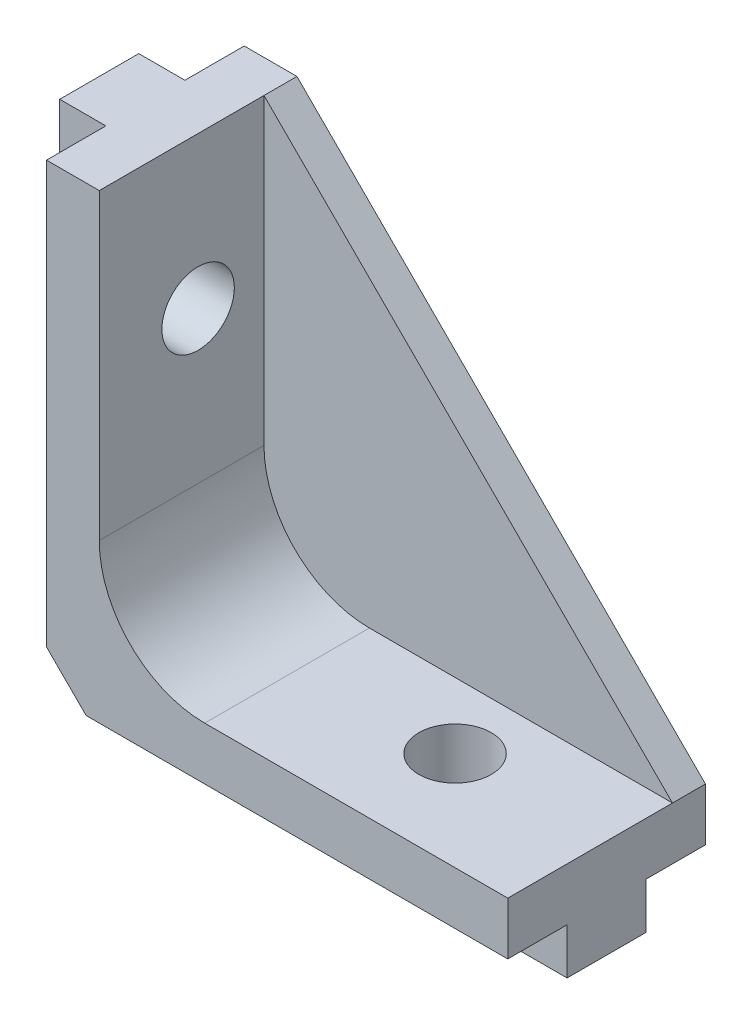
ISO-10303-21;
HEADER;
FILE_DESCRIPTION(('STEP AP214'),'2;1');
FILE_NAME('part.step','',(''),(''),'','','');
FILE_SCHEMA(('AUTOMOTIVE_DESIGN { 1 0 10303 214 1 1 1 1 }'));
ENDSEC;
DATA;
#1=APPLICATION_CONTEXT('core data for automotive mechanical design processes');
#2=APPLICATION_PROTOCOL_DEFINITION('international standard','automotive_design',2000,#1);
#3=PRODUCT_CONTEXT('',#1,'mechanical');
#4=PRODUCT('Part','Part','',(#3));
#5=PRODUCT_RELATED_PRODUCT_CATEGORY('part','',(#4));
#6=PRODUCT_DEFINITION_FORMATION('','',#4);
#7=PRODUCT_DEFINITION_CONTEXT('part definition',#1,'design');
#8=PRODUCT_DEFINITION('design','',#6,#7);
#9=PRODUCT_DEFINITION_SHAPE('','',#8);
#10=(LENGTH_UNIT() NAMED_UNIT(*) SI_UNIT(.MILLI.,.METRE.));
#11=(NAMED_UNIT(*) PLANE_ANGLE_UNIT() SI_UNIT($,.RADIAN.));
#12=(NAMED_UNIT(*) SI_UNIT($,.STERADIAN.) SOLID_ANGLE_UNIT());
#13=UNCERTAINTY_MEASURE_WITH_UNIT(LENGTH_MEASURE(1.E-05),#10,'distance_accuracy_value','');
#14=(GEOMETRIC_REPRESENTATION_CONTEXT(3) GLOBAL_UNCERTAINTY_ASSIGNED_CONTEXT((#13)) GLOBAL_UNIT_ASSIGNED_CONTEXT((#10,
#11,#12)) REPRESENTATION_CONTEXT('',''));
#15=CARTESIAN_POINT('',(0.,0.,0.));
#16=DIRECTION('',(0.,0.,1.));
#17=DIRECTION('',(1.,0.,0.));
#18=AXIS2_PLACEMENT_3D('',#15,#16,#17);
#19=CARTESIAN_POINT('',(0.,0.,2.5));
#20=DIRECTION('',(1.,0.,0.));
#21=DIRECTION('',(0.,0.,-1.));
#22=AXIS2_PLACEMENT_3D('',#19,#20,#21);
#23=PLANE('',#22);
#24=DIRECTION('',(0.,-1.,0.));
#25=VECTOR('',#24,1.);
#26=CARTESIAN_POINT('',(0.,0.,0.));
#27=LINE('',#26,#25);
#28=CARTESIAN_POINT('',(0.,35.,0.));
#29=VERTEX_POINT('',#28);
#30=CARTESIAN_POINT('',(0.,3.00000000000002,0.));
#31=VERTEX_POINT('',#30);
#32=EDGE_CURVE('E249',#29,#31,#27,.T.);
#33=ORIENTED_EDGE('',*,*,#32,.T.);
#34=DIRECTION('',(0.,0.,1.));
#35=VECTOR('',#34,1.);
#36=CARTESIAN_POINT('',(0.,3.00000000000002,2.5));
#37=LINE('',#36,#35);
#38=CARTESIAN_POINT('',(0.,3.00000000000002,15.));
#39=VERTEX_POINT('',#38);
#40=EDGE_CURVE('E47',#31,#39,#37,.T.);
#41=ORIENTED_EDGE('',*,*,#40,.T.);
#42=DIRECTION('',(0.,-1.,0.));
#43=VECTOR('',#42,1.);
#44=CARTESIAN_POINT('',(0.,35.,15.));
#45=LINE('',#44,#43);
#46=CARTESIAN_POINT('',(0.,35.,15.));
#47=VERTEX_POINT('',#46);
#48=EDGE_CURVE('E233',#47,#39,#45,.T.);
#49=ORIENTED_EDGE('',*,*,#48,.F.);
#50=DIRECTION('',(0.,0.,-1.));
#51=VECTOR('',#50,1.);
#52=CARTESIAN_POINT('',(0.,35.,2.5));
#53=LINE('',#52,#51);
#54=CARTESIAN_POINT('',(0.,35.,10.5));
#55=VERTEX_POINT('',#54);
#56=EDGE_CURVE('E258',#47,#55,#53,.T.);
#57=ORIENTED_EDGE('',*,*,#56,.T.);
#58=DIRECTION('',(0.,1.,0.));
#59=VECTOR('',#58,1.);
#60=CARTESIAN_POINT('',(0.,35.,10.5));
#61=LINE('',#60,#59);
#62=CARTESIAN_POINT('',(0.,4.5,10.5));
#63=VERTEX_POINT('',#62);
#64=EDGE_CURVE('E183',#63,#55,#61,.T.);
#65=ORIENTED_EDGE('',*,*,#64,.F.);
#66=DIRECTION('',(0.,0.,1.));
#67=VECTOR('',#66,1.);
#68=CARTESIAN_POINT('',(0.,4.5,10.5));
#69=LINE('',#68,#67);
#70=CARTESIAN_POINT('',(0.,4.5,4.50000000000002));
#71=VERTEX_POINT('',#70);
#72=EDGE_CURVE('E180',#71,#63,#69,.T.);
#73=ORIENTED_EDGE('',*,*,#72,.F.);
#74=DIRECTION('',(0.,-1.,0.));
#75=VECTOR('',#74,1.);
#76=CARTESIAN_POINT('',(0.,35.,4.5));
#77=LINE('',#76,#75);
#78=CARTESIAN_POINT('',(0.,35.,4.50000000000001));
#79=VERTEX_POINT('',#78);
#80=EDGE_CURVE('E370',#79,#71,#77,.T.);
#81=ORIENTED_EDGE('',*,*,#80,.F.);
#82=EDGE_CURVE('E248',#79,#29,#53,.T.);
#83=ORIENTED_EDGE('',*,*,#82,.T.);
#84=EDGE_LOOP('',(#33,#41,#49,#57,#65,#73,#81,#83));
#85=FACE_BOUND('',#84,.T.);
#86=ADVANCED_FACE('F39',(#85),#23,.F.);
#87=CARTESIAN_POINT('',(35.,0.,2.5));
#88=DIRECTION('',(0.,1.,0.));
#89=DIRECTION('',(-1.,0.,0.));
#90=AXIS2_PLACEMENT_3D('',#87,#88,#89);
#91=PLANE('',#90);
#92=DIRECTION('',(1.,0.,0.));
#93=VECTOR('',#92,1.);
#94=CARTESIAN_POINT('',(0.,0.,15.));
#95=LINE('',#94,#93);
#96=CARTESIAN_POINT('',(3.00000000000001,0.,15.));
#97=VERTEX_POINT('',#96);
#98=CARTESIAN_POINT('',(35.,0.,15.));
#99=VERTEX_POINT('',#98);
#100=EDGE_CURVE('E220',#97,#99,#95,.T.);
#101=ORIENTED_EDGE('',*,*,#100,.F.);
#102=DIRECTION('',(0.,0.,-1.));
#103=VECTOR('',#102,1.);
#104=CARTESIAN_POINT('',(3.00000000000001,0.,2.5));
#105=LINE('',#104,#103);
#106=CARTESIAN_POINT('',(3.00000000000001,0.,0.));
#107=VERTEX_POINT('',#106);
#108=EDGE_CURVE('E279',#97,#107,#105,.T.);
#109=ORIENTED_EDGE('',*,*,#108,.T.);
#110=DIRECTION('',(1.,0.,0.));
#111=VECTOR('',#110,1.);
#112=CARTESIAN_POINT('',(35.,0.,0.));
#113=LINE('',#112,#111);
#114=CARTESIAN_POINT('',(35.,0.,0.));
#115=VERTEX_POINT('',#114);
#116=EDGE_CURVE('E244',#107,#115,#113,.T.);
#117=ORIENTED_EDGE('',*,*,#116,.T.);
#118=DIRECTION('',(0.,0.,-1.));
#119=VECTOR('',#118,1.);
#120=CARTESIAN_POINT('',(35.,0.,2.5));
#121=LINE('',#120,#119);
#122=CARTESIAN_POINT('',(35.,0.,4.5));
#123=VERTEX_POINT('',#122);
#124=EDGE_CURVE('E266',#123,#115,#121,.T.);
#125=ORIENTED_EDGE('',*,*,#124,.F.);
#126=DIRECTION('',(1.,0.,0.));
#127=VECTOR('',#126,1.);
#128=CARTESIAN_POINT('',(35.,0.,4.5));
#129=LINE('',#128,#127);
#130=CARTESIAN_POINT('',(4.5,0.,4.5));
#131=VERTEX_POINT('',#130);
#132=EDGE_CURVE('E197',#131,#123,#129,.T.);
#133=ORIENTED_EDGE('',*,*,#132,.F.);
#134=DIRECTION('',(0.,0.,-1.));
#135=VECTOR('',#134,1.);
#136=CARTESIAN_POINT('',(4.5,0.,10.5));
#137=LINE('',#136,#135);
#138=CARTESIAN_POINT('',(4.5,0.,10.5));
#139=VERTEX_POINT('',#138);
#140=EDGE_CURVE('E187',#139,#131,#137,.T.);
#141=ORIENTED_EDGE('',*,*,#140,.F.);
#142=DIRECTION('',(-1.,0.,0.));
#143=VECTOR('',#142,1.);
#144=CARTESIAN_POINT('',(35.,0.,10.5));
#145=LINE('',#144,#143);
#146=CARTESIAN_POINT('',(35.,0.,10.5));
#147=VERTEX_POINT('',#146);
#148=EDGE_CURVE('E184',#147,#139,#145,.T.);
#149=ORIENTED_EDGE('',*,*,#148,.F.);
#150=EDGE_CURVE('E267',#99,#147,#121,.T.);
#151=ORIENTED_EDGE('',*,*,#150,.F.);
#152=EDGE_LOOP('',(#101,#109,#117,#125,#133,#141,#149,#151));
#153=FACE_BOUND('',#152,.T.);
#154=ADVANCED_FACE('F285',(#153),#91,.F.);
#155=CARTESIAN_POINT('',(0.,0.,2.5));
#156=DIRECTION('',(0.,0.,-1.));
#157=DIRECTION('',(-1.,0.,0.));
#158=AXIS2_PLACEMENT_3D('',#155,#156,#157);
#159=PLANE('',#158);
#160=DIRECTION('',(0.,1.,0.));
#161=VECTOR('',#160,1.);
#162=CARTESIAN_POINT('',(4.,35.,2.5));
#163=LINE('',#162,#161);
#164=CARTESIAN_POINT('',(4.,12.,2.5));
#165=VERTEX_POINT('',#164);
#166=CARTESIAN_POINT('',(4.,35.,2.5));
#167=VERTEX_POINT('',#166);
#168=EDGE_CURVE('E223',#165,#167,#163,.T.);
#169=ORIENTED_EDGE('',*,*,#168,.F.);
#170=CARTESIAN_POINT('',(12.,12.,2.5));
#171=DIRECTION('',(0.,0.,-1.));
#172=DIRECTION('',(-1.,0.,0.));
#173=AXIS2_PLACEMENT_3D('',#170,#171,#172);
#174=CIRCLE('',#173,8.);
#175=CARTESIAN_POINT('',(12.,4.,2.5));
#176=VERTEX_POINT('',#175);
#177=EDGE_CURVE('E273',#165,#176,#174,.F.);
#178=ORIENTED_EDGE('',*,*,#177,.T.);
#179=DIRECTION('',(-1.,0.,0.));
#180=VECTOR('',#179,1.);
#181=CARTESIAN_POINT('',(4.,4.,2.5));
#182=LINE('',#181,#180);
#183=CARTESIAN_POINT('',(35.,4.,2.5));
#184=VERTEX_POINT('',#183);
#185=EDGE_CURVE('E219',#184,#176,#182,.T.);
#186=ORIENTED_EDGE('',*,*,#185,.F.);
#187=DIRECTION('',(-0.707106781186547,0.707106781186548,0.));
#188=VECTOR('',#187,1.);
#189=CARTESIAN_POINT('',(4.,35.,2.5));
#190=LINE('',#189,#188);
#191=EDGE_CURVE('E245',#184,#167,#190,.T.);
#192=ORIENTED_EDGE('',*,*,#191,.T.);
#193=EDGE_LOOP('',(#169,#178,#186,#192));
#194=FACE_BOUND('',#193,.T.);
#195=ADVANCED_FACE('F341',(#194),#159,.F.);
#196=CARTESIAN_POINT('',(35.,4.,2.5));
#197=DIRECTION('',(-1.,0.,0.));
#198=DIRECTION('',(0.,-1.,0.));
#199=AXIS2_PLACEMENT_3D('',#196,#197,#198);
#200=PLANE('',#199);
#201=DIRECTION('',(0.,1.,0.));
#202=VECTOR('',#201,1.);
#203=CARTESIAN_POINT('',(35.,4.,0.));
#204=LINE('',#203,#202);
#205=CARTESIAN_POINT('',(35.,4.,0.));
#206=VERTEX_POINT('',#205);
#207=EDGE_CURVE('E251',#115,#206,#204,.T.);
#208=ORIENTED_EDGE('',*,*,#207,.T.);
#209=DIRECTION('',(0.,0.,-1.));
#210=VECTOR('',#209,1.);
#211=CARTESIAN_POINT('',(35.,4.,2.5));
#212=LINE('',#211,#210);
#213=EDGE_CURVE('E263',#184,#206,#212,.T.);
#214=ORIENTED_EDGE('',*,*,#213,.F.);
#215=DIRECTION('',(0.,0.,-1.));
#216=VECTOR('',#215,1.);
#217=CARTESIAN_POINT('',(35.,4.,15.));
#218=LINE('',#217,#216);
#219=CARTESIAN_POINT('',(35.,4.,15.));
#220=VERTEX_POINT('',#219);
#221=EDGE_CURVE('E241',#220,#184,#218,.T.);
#222=ORIENTED_EDGE('',*,*,#221,.F.);
#223=DIRECTION('',(0.,1.,0.));
#224=VECTOR('',#223,1.);
#225=CARTESIAN_POINT('',(35.,0.,15.));
#226=LINE('',#225,#224);
#227=EDGE_CURVE('E222',#99,#220,#226,.T.);
#228=ORIENTED_EDGE('',*,*,#227,.F.);
#229=ORIENTED_EDGE('',*,*,#150,.T.);
#230=DIRECTION('',(0.,1.,0.));
#231=VECTOR('',#230,1.);
#232=CARTESIAN_POINT('',(35.,-3.5,10.5));
#233=LINE('',#232,#231);
#234=CARTESIAN_POINT('',(35.,-3.5,10.5));
#235=VERTEX_POINT('',#234);
#236=EDGE_CURVE('E216',#235,#147,#233,.T.);
#237=ORIENTED_EDGE('',*,*,#236,.F.);
#238=DIRECTION('',(0.,0.,1.));
#239=VECTOR('',#238,1.);
#240=CARTESIAN_POINT('',(35.,-3.5,10.5));
#241=LINE('',#240,#239);
#242=CARTESIAN_POINT('',(35.,-3.5,4.5));
#243=VERTEX_POINT('',#242);
#244=EDGE_CURVE('E193',#243,#235,#241,.T.);
#245=ORIENTED_EDGE('',*,*,#244,.F.);
#246=DIRECTION('',(0.,1.,0.));
#247=VECTOR('',#246,1.);
#248=CARTESIAN_POINT('',(35.,-3.5,4.5));
#249=LINE('',#248,#247);
#250=EDGE_CURVE('E202',#243,#123,#249,.T.);
#251=ORIENTED_EDGE('',*,*,#250,.T.);
#252=ORIENTED_EDGE('',*,*,#124,.T.);
#253=EDGE_LOOP('',(#208,#214,#222,#228,#229,#237,#245,#251,#252));
#254=FACE_BOUND('',#253,.T.);
#255=ADVANCED_FACE('F296',(#254),#200,.F.);
#256=CARTESIAN_POINT('',(4.,35.,2.5));
#257=DIRECTION('',(-0.707106781186548,-0.707106781186547,0.));
#258=DIRECTION('',(0.707106781186547,-0.707106781186548,0.));
#259=AXIS2_PLACEMENT_3D('',#256,#257,#258);
#260=PLANE('',#259);
#261=DIRECTION('',(-0.707106781186547,0.707106781186548,0.));
#262=VECTOR('',#261,1.);
#263=CARTESIAN_POINT('',(4.,35.,0.));
#264=LINE('',#263,#262);
#265=CARTESIAN_POINT('',(4.,35.,0.));
#266=VERTEX_POINT('',#265);
#267=EDGE_CURVE('E253',#206,#266,#264,.T.);
#268=ORIENTED_EDGE('',*,*,#267,.T.);
#269=DIRECTION('',(0.,0.,-1.));
#270=VECTOR('',#269,1.);
#271=CARTESIAN_POINT('',(4.,35.,2.5));
#272=LINE('',#271,#270);
#273=EDGE_CURVE('E260',#167,#266,#272,.T.);
#274=ORIENTED_EDGE('',*,*,#273,.F.);
#275=ORIENTED_EDGE('',*,*,#191,.F.);
#276=ORIENTED_EDGE('',*,*,#213,.T.);
#277=EDGE_LOOP('',(#268,#274,#275,#276));
#278=FACE_BOUND('',#277,.T.);
#279=ADVANCED_FACE('F300',(#278),#260,.F.);
#280=CARTESIAN_POINT('',(0.,35.,2.5));
#281=DIRECTION('',(0.,-1.,0.));
#282=DIRECTION('',(0.,0.,-1.));
#283=AXIS2_PLACEMENT_3D('',#280,#281,#282);
#284=PLANE('',#283);
#285=DIRECTION('',(-1.,0.,0.));
#286=VECTOR('',#285,1.);
#287=CARTESIAN_POINT('',(0.,35.,0.));
#288=LINE('',#287,#286);
#289=EDGE_CURVE('E255',#266,#29,#288,.T.);
#290=ORIENTED_EDGE('',*,*,#289,.T.);
#291=ORIENTED_EDGE('',*,*,#82,.F.);
#292=DIRECTION('',(1.,0.,0.));
#293=VECTOR('',#292,1.);
#294=CARTESIAN_POINT('',(-3.5,35.,4.5));
#295=LINE('',#294,#293);
#296=CARTESIAN_POINT('',(-3.5,35.,4.5));
#297=VERTEX_POINT('',#296);
#298=EDGE_CURVE('E167',#297,#79,#295,.T.);
#299=ORIENTED_EDGE('',*,*,#298,.F.);
#300=DIRECTION('',(0.,0.,-1.));
#301=VECTOR('',#300,1.);
#302=CARTESIAN_POINT('',(-3.5,35.,10.5));
#303=LINE('',#302,#301);
#304=CARTESIAN_POINT('',(-3.5,35.,10.5));
#305=VERTEX_POINT('',#304);
#306=EDGE_CURVE('E158',#305,#297,#303,.T.);
#307=ORIENTED_EDGE('',*,*,#306,.F.);
#308=DIRECTION('',(1.,0.,0.));
#309=VECTOR('',#308,1.);
#310=CARTESIAN_POINT('',(-3.5,35.,10.5));
#311=LINE('',#310,#309);
#312=EDGE_CURVE('E163',#305,#55,#311,.T.);
#313=ORIENTED_EDGE('',*,*,#312,.T.);
#314=ORIENTED_EDGE('',*,*,#56,.F.);
#315=DIRECTION('',(-1.,0.,0.));
#316=VECTOR('',#315,1.);
#317=CARTESIAN_POINT('',(4.,35.,15.));
#318=LINE('',#317,#316);
#319=CARTESIAN_POINT('',(4.,35.,15.));
#320=VERTEX_POINT('',#319);
#321=EDGE_CURVE('E230',#320,#47,#318,.T.);
#322=ORIENTED_EDGE('',*,*,#321,.F.);
#323=DIRECTION('',(0.,0.,-1.));
#324=VECTOR('',#323,1.);
#325=CARTESIAN_POINT('',(4.,35.,15.));
#326=LINE('',#325,#324);
#327=EDGE_CURVE('E235',#320,#167,#326,.T.);
#328=ORIENTED_EDGE('',*,*,#327,.T.);
#329=ORIENTED_EDGE('',*,*,#273,.T.);
#330=EDGE_LOOP('',(#290,#291,#299,#307,#313,#314,#322,#328,#329));
#331=FACE_BOUND('',#330,.T.);
#332=ADVANCED_FACE('F161',(#331),#284,.F.);
#333=CARTESIAN_POINT('',(0.,0.,0.));
#334=DIRECTION('',(0.,0.,-1.));
#335=DIRECTION('',(-1.,0.,0.));
#336=AXIS2_PLACEMENT_3D('',#333,#334,#335);
#337=PLANE('',#336);
#338=ORIENTED_EDGE('',*,*,#116,.F.);
#339=DIRECTION('',(0.707106781186547,-0.707106781186548,0.));
#340=VECTOR('',#339,1.);
#341=CARTESIAN_POINT('',(1.50000000000001,1.5,0.));
#342=LINE('',#341,#340);
#343=EDGE_CURVE('E61',#107,#31,#342,.F.);
#344=ORIENTED_EDGE('',*,*,#343,.T.);
#345=ORIENTED_EDGE('',*,*,#32,.F.);
#346=ORIENTED_EDGE('',*,*,#289,.F.);
#347=ORIENTED_EDGE('',*,*,#267,.F.);
#348=ORIENTED_EDGE('',*,*,#207,.F.);
#349=EDGE_LOOP('',(#338,#344,#345,#346,#347,#348));
#350=FACE_BOUND('',#349,.T.);
#351=ADVANCED_FACE('F291',(#350),#337,.T.);
#352=CARTESIAN_POINT('',(4.,4.,15.));
#353=DIRECTION('',(0.,-1.,0.));
#354=DIRECTION('',(0.,0.,-1.));
#355=AXIS2_PLACEMENT_3D('',#352,#353,#354);
#356=PLANE('',#355);
#357=CARTESIAN_POINT('',(23.5,4.,7.5));
#358=DIRECTION('',(0.,1.,0.));
#359=DIRECTION('',(0.,0.,1.));
#360=AXIS2_PLACEMENT_3D('',#357,#358,#359);
#361=CIRCLE('',#360,2.75);
#362=CARTESIAN_POINT('',(23.5,4.,10.25));
#363=VERTEX_POINT('',#362);
#364=EDGE_CURVE('E392',#363,#363,#361,.T.);
#365=ORIENTED_EDGE('',*,*,#364,.F.);
#366=EDGE_LOOP('',(#365));
#367=FACE_BOUND('',#366,.T.);
#368=ORIENTED_EDGE('',*,*,#185,.T.);
#369=DIRECTION('',(0.,0.,-1.));
#370=VECTOR('',#369,1.);
#371=CARTESIAN_POINT('',(12.,4.,15.));
#372=LINE('',#371,#370);
#373=CARTESIAN_POINT('',(12.,4.,15.));
#374=VERTEX_POINT('',#373);
#375=EDGE_CURVE('E275',#176,#374,#372,.F.);
#376=ORIENTED_EDGE('',*,*,#375,.T.);
#377=DIRECTION('',(-1.,0.,0.));
#378=VECTOR('',#377,1.);
#379=CARTESIAN_POINT('',(4.,4.,15.));
#380=LINE('',#379,#378);
#381=EDGE_CURVE('E225',#220,#374,#380,.T.);
#382=ORIENTED_EDGE('',*,*,#381,.F.);
#383=ORIENTED_EDGE('',*,*,#221,.T.);
#384=EDGE_LOOP('',(#368,#376,#382,#383));
#385=FACE_BOUND('',#384,.T.);
#386=ADVANCED_FACE('F306',(#367,#385),#356,.F.);
#387=CARTESIAN_POINT('',(4.,35.,15.));
#388=DIRECTION('',(-1.,0.,0.));
#389=DIRECTION('',(0.,-1.,0.));
#390=AXIS2_PLACEMENT_3D('',#387,#388,#389);
#391=PLANE('',#390);
#392=CARTESIAN_POINT('',(4.,23.5,7.5));
#393=DIRECTION('',(1.,0.,0.));
#394=DIRECTION('',(0.,0.,-1.));
#395=AXIS2_PLACEMENT_3D('',#392,#393,#394);
#396=CIRCLE('',#395,2.75);
#397=CARTESIAN_POINT('',(4.,23.5,4.75));
#398=VERTEX_POINT('',#397);
#399=EDGE_CURVE('E386',#398,#398,#396,.T.);
#400=ORIENTED_EDGE('',*,*,#399,.F.);
#401=EDGE_LOOP('',(#400));
#402=FACE_BOUND('',#401,.T.);
#403=DIRECTION('',(0.,1.,0.));
#404=VECTOR('',#403,1.);
#405=CARTESIAN_POINT('',(4.,35.,15.));
#406=LINE('',#405,#404);
#407=CARTESIAN_POINT('',(4.,12.,15.));
#408=VERTEX_POINT('',#407);
#409=EDGE_CURVE('E228',#408,#320,#406,.T.);
#410=ORIENTED_EDGE('',*,*,#409,.F.);
#411=DIRECTION('',(0.,0.,-1.));
#412=VECTOR('',#411,1.);
#413=CARTESIAN_POINT('',(4.,12.,2.5));
#414=LINE('',#413,#412);
#415=EDGE_CURVE('E270',#408,#165,#414,.T.);
#416=ORIENTED_EDGE('',*,*,#415,.T.);
#417=ORIENTED_EDGE('',*,*,#168,.T.);
#418=ORIENTED_EDGE('',*,*,#327,.F.);
#419=EDGE_LOOP('',(#410,#416,#417,#418));
#420=FACE_BOUND('',#419,.T.);
#421=ADVANCED_FACE('F366',(#402,#420),#391,.F.);
#422=CARTESIAN_POINT('',(0.,0.,15.));
#423=DIRECTION('',(0.,0.,1.));
#424=DIRECTION('',(1.,0.,0.));
#425=AXIS2_PLACEMENT_3D('',#422,#423,#424);
#426=PLANE('',#425);
#427=ORIENTED_EDGE('',*,*,#48,.T.);
#428=DIRECTION('',(-0.707106781186547,0.707106781186548,0.));
#429=VECTOR('',#428,1.);
#430=CARTESIAN_POINT('',(1.50000000000001,1.5,15.));
#431=LINE('',#430,#429);
#432=EDGE_CURVE('E11',#39,#97,#431,.F.);
#433=ORIENTED_EDGE('',*,*,#432,.T.);
#434=ORIENTED_EDGE('',*,*,#100,.T.);
#435=ORIENTED_EDGE('',*,*,#227,.T.);
#436=ORIENTED_EDGE('',*,*,#381,.T.);
#437=CARTESIAN_POINT('',(12.,12.,15.));
#438=DIRECTION('',(0.,0.,1.));
#439=DIRECTION('',(1.,0.,0.));
#440=AXIS2_PLACEMENT_3D('',#437,#438,#439);
#441=CIRCLE('',#440,8.);
#442=EDGE_CURVE('E277',#374,#408,#441,.F.);
#443=ORIENTED_EDGE('',*,*,#442,.T.);
#444=ORIENTED_EDGE('',*,*,#409,.T.);
#445=ORIENTED_EDGE('',*,*,#321,.T.);
#446=EDGE_LOOP('',(#427,#433,#434,#435,#436,#443,#444,#445));
#447=FACE_BOUND('',#446,.T.);
#448=ADVANCED_FACE('F311',(#447),#426,.T.);
#449=CARTESIAN_POINT('',(35.,-3.5,10.5));
#450=DIRECTION('',(0.,0.,-1.));
#451=DIRECTION('',(-1.,0.,0.));
#452=AXIS2_PLACEMENT_3D('',#449,#450,#451);
#453=PLANE('',#452);
#454=ORIENTED_EDGE('',*,*,#148,.T.);
#455=DIRECTION('',(0.,1.,0.));
#456=VECTOR('',#455,1.);
#457=CARTESIAN_POINT('',(4.5,-3.5,10.5));
#458=LINE('',#457,#456);
#459=CARTESIAN_POINT('',(4.5,-3.5,10.5));
#460=VERTEX_POINT('',#459);
#461=EDGE_CURVE('E213',#460,#139,#458,.T.);
#462=ORIENTED_EDGE('',*,*,#461,.F.);
#463=DIRECTION('',(-1.,0.,0.));
#464=VECTOR('',#463,1.);
#465=CARTESIAN_POINT('',(35.,-3.5,10.5));
#466=LINE('',#465,#464);
#467=EDGE_CURVE('E196',#235,#460,#466,.T.);
#468=ORIENTED_EDGE('',*,*,#467,.F.);
#469=ORIENTED_EDGE('',*,*,#236,.T.);
#470=EDGE_LOOP('',(#454,#462,#468,#469));
#471=FACE_BOUND('',#470,.T.);
#472=ADVANCED_FACE('F315',(#471),#453,.F.);
#473=CARTESIAN_POINT('',(4.5,-3.5,10.5));
#474=DIRECTION('',(1.,0.,0.));
#475=DIRECTION('',(0.,0.,-1.));
#476=AXIS2_PLACEMENT_3D('',#473,#474,#475);
#477=PLANE('',#476);
#478=ORIENTED_EDGE('',*,*,#140,.T.);
#479=DIRECTION('',(0.,1.,0.));
#480=VECTOR('',#479,1.);
#481=CARTESIAN_POINT('',(4.5,-3.5,4.5));
#482=LINE('',#481,#480);
#483=CARTESIAN_POINT('',(4.5,-3.5,4.5));
#484=VERTEX_POINT('',#483);
#485=EDGE_CURVE('E210',#484,#131,#482,.T.);
#486=ORIENTED_EDGE('',*,*,#485,.F.);
#487=DIRECTION('',(0.,0.,-1.));
#488=VECTOR('',#487,1.);
#489=CARTESIAN_POINT('',(4.5,-3.5,10.5));
#490=LINE('',#489,#488);
#491=EDGE_CURVE('E199',#460,#484,#490,.T.);
#492=ORIENTED_EDGE('',*,*,#491,.F.);
#493=ORIENTED_EDGE('',*,*,#461,.T.);
#494=EDGE_LOOP('',(#478,#486,#492,#493));
#495=FACE_BOUND('',#494,.T.);
#496=ADVANCED_FACE('F318',(#495),#477,.F.);
#497=CARTESIAN_POINT('',(35.,-3.5,4.5));
#498=DIRECTION('',(0.,0.,1.));
#499=DIRECTION('',(1.,0.,0.));
#500=AXIS2_PLACEMENT_3D('',#497,#498,#499);
#501=PLANE('',#500);
#502=ORIENTED_EDGE('',*,*,#132,.T.);
#503=ORIENTED_EDGE('',*,*,#250,.F.);
#504=DIRECTION('',(1.,0.,0.));
#505=VECTOR('',#504,1.);
#506=CARTESIAN_POINT('',(35.,-3.5,4.5));
#507=LINE('',#506,#505);
#508=EDGE_CURVE('E201',#484,#243,#507,.T.);
#509=ORIENTED_EDGE('',*,*,#508,.F.);
#510=ORIENTED_EDGE('',*,*,#485,.T.);
#511=EDGE_LOOP('',(#502,#503,#509,#510));
#512=FACE_BOUND('',#511,.T.);
#513=ADVANCED_FACE('F326',(#512),#501,.F.);
#514=CARTESIAN_POINT('',(0.,-3.5,0.));
#515=DIRECTION('',(0.,1.,0.));
#516=DIRECTION('',(-1.,0.,0.));
#517=AXIS2_PLACEMENT_3D('',#514,#515,#516);
#518=PLANE('',#517);
#519=CARTESIAN_POINT('',(23.5,-3.5,7.5));
#520=DIRECTION('',(0.,1.,0.));
#521=DIRECTION('',(-1.,0.,0.));
#522=AXIS2_PLACEMENT_3D('',#519,#520,#521);
#523=CIRCLE('',#522,2.75);
#524=CARTESIAN_POINT('',(20.75,-3.5,7.5));
#525=VERTEX_POINT('',#524);
#526=EDGE_CURVE('E389',#525,#525,#523,.F.);
#527=ORIENTED_EDGE('',*,*,#526,.F.);
#528=EDGE_LOOP('',(#527));
#529=FACE_BOUND('',#528,.T.);
#530=ORIENTED_EDGE('',*,*,#244,.T.);
#531=ORIENTED_EDGE('',*,*,#467,.T.);
#532=ORIENTED_EDGE('',*,*,#491,.T.);
#533=ORIENTED_EDGE('',*,*,#508,.T.);
#534=EDGE_LOOP('',(#530,#531,#532,#533));
#535=FACE_BOUND('',#534,.T.);
#536=ADVANCED_FACE('F322',(#529,#535),#518,.F.);
#537=CARTESIAN_POINT('',(-3.5,35.,10.5));
#538=DIRECTION('',(0.,0.,-1.));
#539=DIRECTION('',(0.,1.,0.));
#540=AXIS2_PLACEMENT_3D('',#537,#538,#539);
#541=PLANE('',#540);
#542=ORIENTED_EDGE('',*,*,#64,.T.);
#543=ORIENTED_EDGE('',*,*,#312,.F.);
#544=DIRECTION('',(0.,1.,0.));
#545=VECTOR('',#544,1.);
#546=CARTESIAN_POINT('',(-3.5,35.,10.5));
#547=LINE('',#546,#545);
#548=CARTESIAN_POINT('',(-3.5,4.5,10.5));
#549=VERTEX_POINT('',#548);
#550=EDGE_CURVE('E171',#549,#305,#547,.T.);
#551=ORIENTED_EDGE('',*,*,#550,.F.);
#552=DIRECTION('',(1.,0.,0.));
#553=VECTOR('',#552,1.);
#554=CARTESIAN_POINT('',(-3.5,4.5,10.5));
#555=LINE('',#554,#553);
#556=EDGE_CURVE('E376',#549,#63,#555,.T.);
#557=ORIENTED_EDGE('',*,*,#556,.T.);
#558=EDGE_LOOP('',(#542,#543,#551,#557));
#559=FACE_BOUND('',#558,.T.);
#560=ADVANCED_FACE('F182',(#559),#541,.F.);
#561=CARTESIAN_POINT('',(-3.5,35.,4.5));
#562=DIRECTION('',(0.,0.,1.));
#563=DIRECTION('',(0.,-1.,0.));
#564=AXIS2_PLACEMENT_3D('',#561,#562,#563);
#565=PLANE('',#564);
#566=ORIENTED_EDGE('',*,*,#80,.T.);
#567=DIRECTION('',(1.,0.,0.));
#568=VECTOR('',#567,1.);
#569=CARTESIAN_POINT('',(-3.5,4.5,4.50000000000002));
#570=LINE('',#569,#568);
#571=CARTESIAN_POINT('',(-3.5,4.5,4.50000000000002));
#572=VERTEX_POINT('',#571);
#573=EDGE_CURVE('E189',#572,#71,#570,.T.);
#574=ORIENTED_EDGE('',*,*,#573,.F.);
#575=DIRECTION('',(0.,-1.,0.));
#576=VECTOR('',#575,1.);
#577=CARTESIAN_POINT('',(-3.5,35.,4.5));
#578=LINE('',#577,#576);
#579=EDGE_CURVE('E170',#297,#572,#578,.T.);
#580=ORIENTED_EDGE('',*,*,#579,.F.);
#581=ORIENTED_EDGE('',*,*,#298,.T.);
#582=EDGE_LOOP('',(#566,#574,#580,#581));
#583=FACE_BOUND('',#582,.T.);
#584=ADVANCED_FACE('F485',(#583),#565,.F.);
#585=CARTESIAN_POINT('',(-3.5,4.5,10.5));
#586=DIRECTION('',(0.,1.,0.));
#587=DIRECTION('',(0.,0.,1.));
#588=AXIS2_PLACEMENT_3D('',#585,#586,#587);
#589=PLANE('',#588);
#590=ORIENTED_EDGE('',*,*,#72,.T.);
#591=ORIENTED_EDGE('',*,*,#556,.F.);
#592=DIRECTION('',(0.,0.,1.));
#593=VECTOR('',#592,1.);
#594=CARTESIAN_POINT('',(-3.5,4.5,10.5));
#595=LINE('',#594,#593);
#596=EDGE_CURVE('E176',#572,#549,#595,.T.);
#597=ORIENTED_EDGE('',*,*,#596,.F.);
#598=ORIENTED_EDGE('',*,*,#573,.T.);
#599=EDGE_LOOP('',(#590,#591,#597,#598));
#600=FACE_BOUND('',#599,.T.);
#601=ADVANCED_FACE('F375',(#600),#589,.F.);
#602=CARTESIAN_POINT('',(-3.5,0.,0.));
#603=DIRECTION('',(1.,0.,0.));
#604=DIRECTION('',(0.,0.,-1.));
#605=AXIS2_PLACEMENT_3D('',#602,#603,#604);
#606=PLANE('',#605);
#607=CARTESIAN_POINT('',(-3.5,23.5,7.5));
#608=DIRECTION('',(1.,0.,0.));
#609=DIRECTION('',(0.,0.,-1.));
#610=AXIS2_PLACEMENT_3D('',#607,#608,#609);
#611=CIRCLE('',#610,2.75);
#612=CARTESIAN_POINT('',(-3.5,23.5,4.75));
#613=VERTEX_POINT('',#612);
#614=EDGE_CURVE('E371',#613,#613,#611,.F.);
#615=ORIENTED_EDGE('',*,*,#614,.F.);
#616=EDGE_LOOP('',(#615));
#617=FACE_BOUND('',#616,.T.);
#618=ORIENTED_EDGE('',*,*,#550,.T.);
#619=ORIENTED_EDGE('',*,*,#306,.T.);
#620=ORIENTED_EDGE('',*,*,#579,.T.);
#621=ORIENTED_EDGE('',*,*,#596,.T.);
#622=EDGE_LOOP('',(#618,#619,#620,#621));
#623=FACE_BOUND('',#622,.T.);
#624=ADVANCED_FACE('F174',(#617,#623),#606,.F.);
#625=CARTESIAN_POINT('',(-3.501,23.5,7.5));
#626=DIRECTION('',(1.,0.,0.));
#627=DIRECTION('',(0.,0.,-1.));
#628=AXIS2_PLACEMENT_3D('',#625,#626,#627);
#629=CYLINDRICAL_SURFACE('',#628,2.75);
#630=ORIENTED_EDGE('',*,*,#399,.T.);
#631=EDGE_LOOP('',(#630));
#632=FACE_BOUND('',#631,.T.);
#633=ORIENTED_EDGE('',*,*,#614,.T.);
#634=EDGE_LOOP('',(#633));
#635=FACE_BOUND('',#634,.T.);
#636=ADVANCED_FACE('F359',(#632,#635),#629,.F.);
#637=CARTESIAN_POINT('',(23.5,-3.501,7.5));
#638=DIRECTION('',(0.,1.,0.));
#639=DIRECTION('',(0.,0.,1.));
#640=AXIS2_PLACEMENT_3D('',#637,#638,#639);
#641=CYLINDRICAL_SURFACE('',#640,2.75);
#642=ORIENTED_EDGE('',*,*,#364,.T.);
#643=EDGE_LOOP('',(#642));
#644=FACE_BOUND('',#643,.T.);
#645=ORIENTED_EDGE('',*,*,#526,.T.);
#646=EDGE_LOOP('',(#645));
#647=FACE_BOUND('',#646,.T.);
#648=ADVANCED_FACE('F353',(#644,#647),#641,.F.);
#649=CARTESIAN_POINT('',(12.,12.,15.));
#650=DIRECTION('',(0.,0.,1.));
#651=DIRECTION('',(1.,0.,0.));
#652=AXIS2_PLACEMENT_3D('',#649,#650,#651);
#653=CYLINDRICAL_SURFACE('',#652,8.);
#654=ORIENTED_EDGE('',*,*,#442,.F.);
#655=ORIENTED_EDGE('',*,*,#375,.F.);
#656=ORIENTED_EDGE('',*,*,#177,.F.);
#657=ORIENTED_EDGE('',*,*,#415,.F.);
#658=EDGE_LOOP('',(#654,#655,#656,#657));
#659=FACE_BOUND('',#658,.T.);
#660=ADVANCED_FACE('F351',(#659),#653,.F.);
#661=CARTESIAN_POINT('',(3.00000000000001,0.,2.5));
#662=DIRECTION('',(0.707106781186548,0.707106781186547,0.));
#663=DIRECTION('',(0.,0.,-1.));
#664=AXIS2_PLACEMENT_3D('',#661,#662,#663);
#665=PLANE('',#664);
#666=ORIENTED_EDGE('',*,*,#432,.F.);
#667=ORIENTED_EDGE('',*,*,#40,.F.);
#668=ORIENTED_EDGE('',*,*,#343,.F.);
#669=ORIENTED_EDGE('',*,*,#108,.F.);
#670=EDGE_LOOP('',(#666,#667,#668,#669));
#671=FACE_BOUND('',#670,.T.);
#672=ADVANCED_FACE('F41',(#671),#665,.F.);
#673=CLOSED_SHELL('',(#86,#154,#195,#255,#279,#332,#351,#386,#421,#448,#472,#496,#513,#536,#560,
#584,#601,#624,#636,#648,#660,#672));
#674=MANIFOLD_SOLID_BREP('B2',#673);
#675=ADVANCED_BREP_SHAPE_REPRESENTATION('',(#18,#674),#14);
#676=SHAPE_DEFINITION_REPRESENTATION(#9,#675);
ENDSEC;
END-ISO-10303-21;
